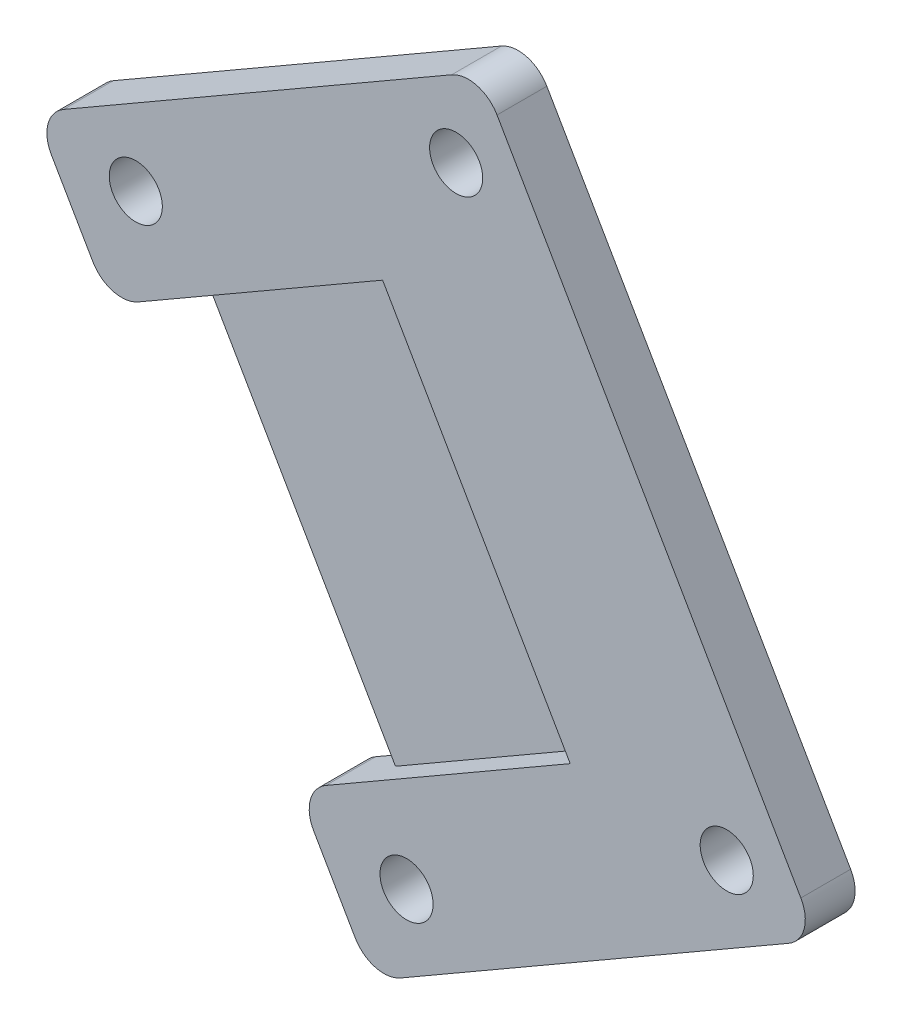
ISO-10303-21;
HEADER;
FILE_DESCRIPTION(('STEP AP214'),'2;1');
FILE_NAME('part.step','',(''),(''),'','','');
FILE_SCHEMA(('AUTOMOTIVE_DESIGN { 1 0 10303 214 1 1 1 1 }'));
ENDSEC;
DATA;
#1=APPLICATION_CONTEXT('core data for automotive mechanical design processes');
#2=APPLICATION_PROTOCOL_DEFINITION('international standard','automotive_design',2000,#1);
#3=PRODUCT_CONTEXT('',#1,'mechanical');
#4=PRODUCT('Part','Part','',(#3));
#5=PRODUCT_RELATED_PRODUCT_CATEGORY('part','',(#4));
#6=PRODUCT_DEFINITION_FORMATION('','',#4);
#7=PRODUCT_DEFINITION_CONTEXT('part definition',#1,'design');
#8=PRODUCT_DEFINITION('design','',#6,#7);
#9=PRODUCT_DEFINITION_SHAPE('','',#8);
#10=(LENGTH_UNIT() NAMED_UNIT(*) SI_UNIT(.MILLI.,.METRE.));
#11=(NAMED_UNIT(*) PLANE_ANGLE_UNIT() SI_UNIT($,.RADIAN.));
#12=(NAMED_UNIT(*) SI_UNIT($,.STERADIAN.) SOLID_ANGLE_UNIT());
#13=UNCERTAINTY_MEASURE_WITH_UNIT(LENGTH_MEASURE(1.E-05),#10,'distance_accuracy_value','');
#14=(GEOMETRIC_REPRESENTATION_CONTEXT(3) GLOBAL_UNCERTAINTY_ASSIGNED_CONTEXT((#13)) GLOBAL_UNIT_ASSIGNED_CONTEXT((#10,
#11,#12)) REPRESENTATION_CONTEXT('',''));
#15=CARTESIAN_POINT('',(0.,0.,0.));
#16=DIRECTION('',(0.,0.,1.));
#17=DIRECTION('',(1.,0.,0.));
#18=AXIS2_PLACEMENT_3D('',#15,#16,#17);
#19=CARTESIAN_POINT('',(-57.6564570166425,-46.3360870627642,-3.));
#20=DIRECTION('',(-0.866025403784438,-0.5,0.));
#21=DIRECTION('',(0.5,-0.866025403784438,0.));
#22=AXIS2_PLACEMENT_3D('',#19,#20,#21);
#23=PLANE('',#22);
#24=DIRECTION('',(0.,0.,1.));
#25=VECTOR('',#24,1.);
#26=CARTESIAN_POINT('',(-57.6564570166425,-46.3360870627642,-3.));
#27=LINE('',#26,#25);
#28=CARTESIAN_POINT('',(-57.6564570166425,-46.3360870627642,-3.));
#29=VERTEX_POINT('',#28);
#30=CARTESIAN_POINT('',(-57.6564570166425,-46.3360870627642,-1.6));
#31=VERTEX_POINT('',#30);
#32=EDGE_CURVE('E241',#29,#31,#27,.T.);
#33=ORIENTED_EDGE('',*,*,#32,.T.);
#34=DIRECTION('',(0.5,-0.866025403784438,0.));
#35=VECTOR('',#34,1.);
#36=CARTESIAN_POINT('',(-68.9564570166425,-26.7639129372359,-1.6));
#37=LINE('',#36,#35);
#38=CARTESIAN_POINT('',(-68.9564570166425,-26.7639129372359,-1.6));
#39=VERTEX_POINT('',#38);
#40=EDGE_CURVE('E156',#39,#31,#37,.T.);
#41=ORIENTED_EDGE('',*,*,#40,.F.);
#42=DIRECTION('',(0.,0.,1.));
#43=VECTOR('',#42,1.);
#44=CARTESIAN_POINT('',(-68.9564570166425,-26.7639129372359,-3.));
#45=LINE('',#44,#43);
#46=CARTESIAN_POINT('',(-68.9564570166425,-26.7639129372359,-3.));
#47=VERTEX_POINT('',#46);
#48=EDGE_CURVE('E224',#47,#39,#45,.T.);
#49=ORIENTED_EDGE('',*,*,#48,.F.);
#50=DIRECTION('',(0.5,-0.866025403784438,0.));
#51=VECTOR('',#50,1.);
#52=CARTESIAN_POINT('',(-57.6564570166425,-46.3360870627642,-3.));
#53=LINE('',#52,#51);
#54=EDGE_CURVE('E207',#47,#29,#53,.T.);
#55=ORIENTED_EDGE('',*,*,#54,.T.);
#56=EDGE_LOOP('',(#33,#41,#49,#55));
#57=FACE_BOUND('',#56,.T.);
#58=ADVANCED_FACE('F33',(#57),#23,.T.);
#59=CARTESIAN_POINT('',(-73.2865840355647,-29.2639129372359,-3.));
#60=DIRECTION('',(-0.866025403784438,-0.500000000000001,0.));
#61=DIRECTION('',(0.500000000000001,-0.866025403784438,0.));
#62=AXIS2_PLACEMENT_3D('',#59,#60,#61);
#63=PLANE('',#62);
#64=DIRECTION('',(0.500000000000001,-0.866025403784438,0.));
#65=VECTOR('',#64,1.);
#66=CARTESIAN_POINT('',(-73.2865840355647,-29.2639129372359,-3.));
#67=LINE('',#66,#65);
#68=CARTESIAN_POINT('',(-76.7865840355647,-23.2017351107448,-3.));
#69=VERTEX_POINT('',#68);
#70=CARTESIAN_POINT('',(-74.2865840355647,-27.531862129667,-3.));
#71=VERTEX_POINT('',#70);
#72=EDGE_CURVE('E201',#69,#71,#67,.T.);
#73=ORIENTED_EDGE('',*,*,#72,.T.);
#74=DIRECTION('',(0.,0.,1.));
#75=VECTOR('',#74,1.);
#76=CARTESIAN_POINT('',(-74.2865840355647,-27.531862129667,-3.));
#77=LINE('',#76,#75);
#78=CARTESIAN_POINT('',(-74.2865840355647,-27.531862129667,0.));
#79=VERTEX_POINT('',#78);
#80=EDGE_CURVE('E278',#71,#79,#77,.T.);
#81=ORIENTED_EDGE('',*,*,#80,.T.);
#82=DIRECTION('',(0.500000000000001,-0.866025403784438,0.));
#83=VECTOR('',#82,1.);
#84=CARTESIAN_POINT('',(-73.2865840355647,-29.2639129372359,0.));
#85=LINE('',#84,#83);
#86=CARTESIAN_POINT('',(-76.7865840355647,-23.2017351107448,0.));
#87=VERTEX_POINT('',#86);
#88=EDGE_CURVE('E198',#87,#79,#85,.T.);
#89=ORIENTED_EDGE('',*,*,#88,.F.);
#90=DIRECTION('',(0.,0.,1.));
#91=VECTOR('',#90,1.);
#92=CARTESIAN_POINT('',(-76.7865840355647,-23.2017351107448,-3.));
#93=LINE('',#92,#91);
#94=EDGE_CURVE('E276',#87,#69,#93,.F.);
#95=ORIENTED_EDGE('',*,*,#94,.T.);
#96=EDGE_LOOP('',(#73,#81,#89,#95));
#97=FACE_BOUND('',#96,.T.);
#98=ADVANCED_FACE('F327',(#97),#63,.T.);
#99=CARTESIAN_POINT('',(-77.7865840355647,-21.4696843031759,-3.));
#100=DIRECTION('',(-0.500000000000001,0.866025403784438,0.));
#101=DIRECTION('',(-0.866025403784438,-0.500000000000001,0.));
#102=AXIS2_PLACEMENT_3D('',#99,#100,#101);
#103=PLANE('',#102);
#104=DIRECTION('',(-0.866025403784438,-0.500000000000001,0.));
#105=VECTOR('',#104,1.);
#106=CARTESIAN_POINT('',(-77.7865840355647,-21.4696843031759,0.));
#107=LINE('',#106,#105);
#108=CARTESIAN_POINT('',(-52.671847325816,-6.96968430317589,0.));
#109=VERTEX_POINT('',#108);
#110=CARTESIAN_POINT('',(-76.0545332279958,-20.4696843031759,0.));
#111=VERTEX_POINT('',#110);
#112=EDGE_CURVE('E205',#109,#111,#107,.T.);
#113=ORIENTED_EDGE('',*,*,#112,.F.);
#114=DIRECTION('',(0.,0.,1.));
#115=VECTOR('',#114,1.);
#116=CARTESIAN_POINT('',(-52.671847325816,-6.96968430317589,-3.));
#117=LINE('',#116,#115);
#118=CARTESIAN_POINT('',(-52.671847325816,-6.96968430317589,-3.));
#119=VERTEX_POINT('',#118);
#120=EDGE_CURVE('E290',#109,#119,#117,.F.);
#121=ORIENTED_EDGE('',*,*,#120,.T.);
#122=DIRECTION('',(-0.866025403784438,-0.500000000000001,0.));
#123=VECTOR('',#122,1.);
#124=CARTESIAN_POINT('',(-77.7865840355647,-21.4696843031759,-3.));
#125=LINE('',#124,#123);
#126=CARTESIAN_POINT('',(-76.0545332279958,-20.4696843031759,-3.));
#127=VERTEX_POINT('',#126);
#128=EDGE_CURVE('E221',#119,#127,#125,.T.);
#129=ORIENTED_EDGE('',*,*,#128,.T.);
#130=DIRECTION('',(0.,0.,1.));
#131=VECTOR('',#130,1.);
#132=CARTESIAN_POINT('',(-76.0545332279958,-20.4696843031759,-3.));
#133=LINE('',#132,#131);
#134=EDGE_CURVE('E287',#127,#111,#133,.T.);
#135=ORIENTED_EDGE('',*,*,#134,.T.);
#136=EDGE_LOOP('',(#113,#121,#129,#135));
#137=FACE_BOUND('',#136,.T.);
#138=ADVANCED_FACE('F335',(#137),#103,.T.);
#139=CARTESIAN_POINT('',(-50.9397965182471,-5.96968430317589,-3.));
#140=DIRECTION('',(0.866025403784438,0.500000000000001,0.));
#141=DIRECTION('',(-0.500000000000001,0.866025403784438,0.));
#142=AXIS2_PLACEMENT_3D('',#139,#140,#141);
#143=PLANE('',#142);
#144=DIRECTION('',(-0.500000000000001,0.866025403784438,0.));
#145=VECTOR('',#144,1.);
#146=CARTESIAN_POINT('',(-50.9397965182471,-5.96968430317589,-3.));
#147=LINE('',#146,#145);
#148=CARTESIAN_POINT('',(-31.639796518247,-39.3982648892552,-3.));
#149=VERTEX_POINT('',#148);
#150=CARTESIAN_POINT('',(-49.9397965182471,-7.70173511074477,-3.));
#151=VERTEX_POINT('',#150);
#152=EDGE_CURVE('E218',#149,#151,#147,.T.);
#153=ORIENTED_EDGE('',*,*,#152,.T.);
#154=DIRECTION('',(0.,0.,1.));
#155=VECTOR('',#154,1.);
#156=CARTESIAN_POINT('',(-49.9397965182471,-7.70173511074476,-3.));
#157=LINE('',#156,#155);
#158=CARTESIAN_POINT('',(-49.9397965182471,-7.70173511074477,0.));
#159=VERTEX_POINT('',#158);
#160=EDGE_CURVE('E284',#151,#159,#157,.T.);
#161=ORIENTED_EDGE('',*,*,#160,.T.);
#162=DIRECTION('',(-0.500000000000001,0.866025403784438,0.));
#163=VECTOR('',#162,1.);
#164=CARTESIAN_POINT('',(-50.9397965182471,-5.96968430317589,0.));
#165=LINE('',#164,#163);
#166=CARTESIAN_POINT('',(-31.639796518247,-39.3982648892552,0.));
#167=VERTEX_POINT('',#166);
#168=EDGE_CURVE('E236',#167,#159,#165,.T.);
#169=ORIENTED_EDGE('',*,*,#168,.F.);
#170=DIRECTION('',(0.,0.,1.));
#171=VECTOR('',#170,1.);
#172=CARTESIAN_POINT('',(-31.639796518247,-39.3982648892552,-3.));
#173=LINE('',#172,#171);
#174=EDGE_CURVE('E282',#167,#149,#173,.F.);
#175=ORIENTED_EDGE('',*,*,#174,.T.);
#176=EDGE_LOOP('',(#153,#161,#169,#175));
#177=FACE_BOUND('',#176,.T.);
#178=ADVANCED_FACE('F344',(#177),#143,.T.);
#179=CARTESIAN_POINT('',(-30.639796518247,-41.1303156968241,-3.));
#180=DIRECTION('',(0.500000000000001,-0.866025403784438,0.));
#181=DIRECTION('',(0.866025403784438,0.500000000000001,0.));
#182=AXIS2_PLACEMENT_3D('',#179,#180,#181);
#183=PLANE('',#182);
#184=DIRECTION('',(0.866025403784438,0.500000000000001,0.));
#185=VECTOR('',#184,1.);
#186=CARTESIAN_POINT('',(-30.639796518247,-41.1303156968241,-3.));
#187=LINE('',#186,#185);
#188=CARTESIAN_POINT('',(-55.7545332279958,-55.6303156968241,-3.));
#189=VERTEX_POINT('',#188);
#190=CARTESIAN_POINT('',(-32.3718473258159,-42.1303156968241,-3.));
#191=VERTEX_POINT('',#190);
#192=EDGE_CURVE('E215',#189,#191,#187,.T.);
#193=ORIENTED_EDGE('',*,*,#192,.T.);
#194=DIRECTION('',(0.,0.,1.));
#195=VECTOR('',#194,1.);
#196=CARTESIAN_POINT('',(-32.3718473258159,-42.1303156968241,-3.));
#197=LINE('',#196,#195);
#198=CARTESIAN_POINT('',(-32.3718473258159,-42.1303156968241,0.));
#199=VERTEX_POINT('',#198);
#200=EDGE_CURVE('E11',#191,#199,#197,.T.);
#201=ORIENTED_EDGE('',*,*,#200,.T.);
#202=DIRECTION('',(0.866025403784438,0.500000000000001,0.));
#203=VECTOR('',#202,1.);
#204=CARTESIAN_POINT('',(-30.639796518247,-41.1303156968241,0.));
#205=LINE('',#204,#203);
#206=CARTESIAN_POINT('',(-55.7545332279958,-55.6303156968241,0.));
#207=VERTEX_POINT('',#206);
#208=EDGE_CURVE('E233',#207,#199,#205,.T.);
#209=ORIENTED_EDGE('',*,*,#208,.F.);
#210=DIRECTION('',(0.,0.,1.));
#211=VECTOR('',#210,1.);
#212=CARTESIAN_POINT('',(-55.7545332279958,-55.6303156968241,-3.));
#213=LINE('',#212,#211);
#214=EDGE_CURVE('E41',#207,#189,#213,.F.);
#215=ORIENTED_EDGE('',*,*,#214,.T.);
#216=EDGE_LOOP('',(#193,#201,#209,#215));
#217=FACE_BOUND('',#216,.T.);
#218=ADVANCED_FACE('F295',(#217),#183,.T.);
#219=CARTESIAN_POINT('',(-57.4865840355646,-56.6303156968241,-3.));
#220=DIRECTION('',(-0.866025403784437,-0.500000000000002,0.));
#221=DIRECTION('',(0.500000000000002,-0.866025403784437,0.));
#222=AXIS2_PLACEMENT_3D('',#219,#220,#221);
#223=PLANE('',#222);
#224=DIRECTION('',(0.500000000000002,-0.866025403784437,0.));
#225=VECTOR('',#224,1.);
#226=CARTESIAN_POINT('',(-57.4865840355646,-56.6303156968241,0.));
#227=LINE('',#226,#225);
#228=CARTESIAN_POINT('',(-60.9865840355647,-50.568137870333,0.));
#229=VERTEX_POINT('',#228);
#230=CARTESIAN_POINT('',(-58.4865840355646,-54.8982648892552,0.));
#231=VERTEX_POINT('',#230);
#232=EDGE_CURVE('E230',#229,#231,#227,.T.);
#233=ORIENTED_EDGE('',*,*,#232,.F.);
#234=DIRECTION('',(0.,0.,1.));
#235=VECTOR('',#234,1.);
#236=CARTESIAN_POINT('',(-60.9865840355647,-50.568137870333,-3.));
#237=LINE('',#236,#235);
#238=CARTESIAN_POINT('',(-60.9865840355647,-50.568137870333,-3.));
#239=VERTEX_POINT('',#238);
#240=EDGE_CURVE('E262',#229,#239,#237,.F.);
#241=ORIENTED_EDGE('',*,*,#240,.T.);
#242=DIRECTION('',(0.500000000000002,-0.866025403784437,0.));
#243=VECTOR('',#242,1.);
#244=CARTESIAN_POINT('',(-57.4865840355646,-56.6303156968241,-3.));
#245=LINE('',#244,#243);
#246=CARTESIAN_POINT('',(-58.4865840355646,-54.8982648892552,-3.));
#247=VERTEX_POINT('',#246);
#248=EDGE_CURVE('E212',#239,#247,#245,.T.);
#249=ORIENTED_EDGE('',*,*,#248,.T.);
#250=DIRECTION('',(0.,0.,1.));
#251=VECTOR('',#250,1.);
#252=CARTESIAN_POINT('',(-58.4865840355646,-54.8982648892552,-3.));
#253=LINE('',#252,#251);
#254=EDGE_CURVE('E259',#247,#231,#253,.T.);
#255=ORIENTED_EDGE('',*,*,#254,.T.);
#256=EDGE_LOOP('',(#233,#241,#249,#255));
#257=FACE_BOUND('',#256,.T.);
#258=ADVANCED_FACE('F307',(#257),#223,.T.);
#259=CARTESIAN_POINT('',(-61.9865840355647,-48.8360870627642,-3.));
#260=DIRECTION('',(-0.500000000000001,0.866025403784438,0.));
#261=DIRECTION('',(-0.866025403784438,-0.500000000000001,0.));
#262=AXIS2_PLACEMENT_3D('',#259,#260,#261);
#263=PLANE('',#262);
#264=DIRECTION('',(-0.866025403784438,-0.500000000000001,0.));
#265=VECTOR('',#264,1.);
#266=CARTESIAN_POINT('',(-61.9865840355647,-48.8360870627642,-3.));
#267=LINE('',#266,#265);
#268=CARTESIAN_POINT('',(-60.2545332279958,-47.8360870627642,-3.));
#269=VERTEX_POINT('',#268);
#270=EDGE_CURVE('E210',#29,#269,#267,.T.);
#271=ORIENTED_EDGE('',*,*,#270,.T.);
#272=DIRECTION('',(0.,0.,1.));
#273=VECTOR('',#272,1.);
#274=CARTESIAN_POINT('',(-60.2545332279958,-47.8360870627642,-3.));
#275=LINE('',#274,#273);
#276=CARTESIAN_POINT('',(-60.2545332279958,-47.8360870627642,0.));
#277=VERTEX_POINT('',#276);
#278=EDGE_CURVE('E243',#269,#277,#275,.T.);
#279=ORIENTED_EDGE('',*,*,#278,.T.);
#280=DIRECTION('',(-0.866025403784438,-0.500000000000001,0.));
#281=VECTOR('',#280,1.);
#282=CARTESIAN_POINT('',(-61.9865840355647,-48.8360870627642,0.));
#283=LINE('',#282,#281);
#284=CARTESIAN_POINT('',(-45.5321013636603,-39.3360870627642,0.));
#285=VERTEX_POINT('',#284);
#286=EDGE_CURVE('E48',#285,#277,#283,.T.);
#287=ORIENTED_EDGE('',*,*,#286,.F.);
#288=DIRECTION('',(0.,0.,1.));
#289=VECTOR('',#288,1.);
#290=CARTESIAN_POINT('',(-45.5321013636603,-39.3360870627642,-1.6));
#291=LINE('',#290,#289);
#292=CARTESIAN_POINT('',(-45.5321013636603,-39.3360870627642,-1.6));
#293=VERTEX_POINT('',#292);
#294=EDGE_CURVE('E145',#293,#285,#291,.T.);
#295=ORIENTED_EDGE('',*,*,#294,.F.);
#296=DIRECTION('',(0.866025403784439,0.5,0.));
#297=VECTOR('',#296,1.);
#298=CARTESIAN_POINT('',(-45.5321013636603,-39.3360870627642,-1.6));
#299=LINE('',#298,#297);
#300=EDGE_CURVE('E150',#31,#293,#299,.T.);
#301=ORIENTED_EDGE('',*,*,#300,.F.);
#302=ORIENTED_EDGE('',*,*,#32,.F.);
#303=EDGE_LOOP('',(#271,#279,#287,#295,#301,#302));
#304=FACE_BOUND('',#303,.T.);
#305=ADVANCED_FACE('F148',(#304),#263,.T.);
#306=CARTESIAN_POINT('',(-68.9564570166425,-26.7639129372359,-3.));
#307=DIRECTION('',(0.5,-0.866025403784438,0.));
#308=DIRECTION('',(0.866025403784438,0.5,0.));
#309=AXIS2_PLACEMENT_3D('',#306,#307,#308);
#310=PLANE('',#309);
#311=DIRECTION('',(0.866025403784438,0.5,0.));
#312=VECTOR('',#311,1.);
#313=CARTESIAN_POINT('',(-68.9564570166425,-26.7639129372359,0.));
#314=LINE('',#313,#312);
#315=CARTESIAN_POINT('',(-71.5545332279958,-28.2639129372359,0.));
#316=VERTEX_POINT('',#315);
#317=CARTESIAN_POINT('',(-56.8321013636603,-19.7639129372359,0.));
#318=VERTEX_POINT('',#317);
#319=EDGE_CURVE('E227',#316,#318,#314,.T.);
#320=ORIENTED_EDGE('',*,*,#319,.F.);
#321=DIRECTION('',(0.,0.,1.));
#322=VECTOR('',#321,1.);
#323=CARTESIAN_POINT('',(-71.5545332279958,-28.2639129372359,-3.));
#324=LINE('',#323,#322);
#325=CARTESIAN_POINT('',(-71.5545332279958,-28.2639129372359,-3.));
#326=VERTEX_POINT('',#325);
#327=EDGE_CURVE('E56',#316,#326,#324,.F.);
#328=ORIENTED_EDGE('',*,*,#327,.T.);
#329=DIRECTION('',(0.866025403784438,0.5,0.));
#330=VECTOR('',#329,1.);
#331=CARTESIAN_POINT('',(-68.9564570166425,-26.7639129372359,-3.));
#332=LINE('',#331,#330);
#333=EDGE_CURVE('E204',#326,#47,#332,.T.);
#334=ORIENTED_EDGE('',*,*,#333,.T.);
#335=ORIENTED_EDGE('',*,*,#48,.T.);
#336=DIRECTION('',(-0.866025403784439,-0.5,0.));
#337=VECTOR('',#336,1.);
#338=CARTESIAN_POINT('',(-56.8321013636603,-19.7639129372359,-1.6));
#339=LINE('',#338,#337);
#340=CARTESIAN_POINT('',(-56.8321013636603,-19.7639129372359,-1.6));
#341=VERTEX_POINT('',#340);
#342=EDGE_CURVE('E164',#341,#39,#339,.T.);
#343=ORIENTED_EDGE('',*,*,#342,.F.);
#344=DIRECTION('',(0.,0.,1.));
#345=VECTOR('',#344,1.);
#346=CARTESIAN_POINT('',(-56.8321013636603,-19.7639129372359,-1.6));
#347=LINE('',#346,#345);
#348=EDGE_CURVE('E155',#341,#318,#347,.T.);
#349=ORIENTED_EDGE('',*,*,#348,.T.);
#350=EDGE_LOOP('',(#320,#328,#334,#335,#343,#349));
#351=FACE_BOUND('',#350,.T.);
#352=ADVANCED_FACE('F319',(#351),#310,.T.);
#353=CARTESIAN_POINT('',(0.,0.,-3.));
#354=DIRECTION('',(0.,0.,-1.));
#355=DIRECTION('',(-1.,0.,0.));
#356=AXIS2_PLACEMENT_3D('',#353,#354,#355);
#357=PLANE('',#356);
#358=CARTESIAN_POINT('',(-36.1038981333848,-39.6662140816864,-3.));
#359=DIRECTION('',(0.,0.,1.));
#360=DIRECTION('',(1.,0.,0.));
#361=AXIS2_PLACEMENT_3D('',#358,#359,#360);
#362=CIRCLE('',#361,1.60000000000001);
#363=CARTESIAN_POINT('',(-34.5038981333848,-39.6662140816864,-3.));
#364=VERTEX_POINT('',#363);
#365=EDGE_CURVE('E177',#364,#364,#362,.T.);
#366=ORIENTED_EDGE('',*,*,#365,.T.);
#367=EDGE_LOOP('',(#366));
#368=FACE_BOUND('',#367,.T.);
#369=CARTESIAN_POINT('',(-52.4038981333848,-11.4337859183136,-3.));
#370=DIRECTION('',(0.,0.,1.));
#371=DIRECTION('',(1.,0.,0.));
#372=AXIS2_PLACEMENT_3D('',#369,#370,#371);
#373=CIRCLE('',#372,1.6);
#374=CARTESIAN_POINT('',(-50.8038981333848,-11.4337859183136,-3.));
#375=VERTEX_POINT('',#374);
#376=EDGE_CURVE('E183',#375,#375,#373,.T.);
#377=ORIENTED_EDGE('',*,*,#376,.T.);
#378=EDGE_LOOP('',(#377));
#379=FACE_BOUND('',#378,.T.);
#380=CARTESIAN_POINT('',(-71.700243720423,-22.5630263124186,-3.));
#381=DIRECTION('',(0.,0.,1.));
#382=DIRECTION('',(1.,0.,0.));
#383=AXIS2_PLACEMENT_3D('',#380,#381,#382);
#384=CIRCLE('',#383,1.6);
#385=CARTESIAN_POINT('',(-70.100243720423,-22.5630263124186,-3.));
#386=VERTEX_POINT('',#385);
#387=EDGE_CURVE('E189',#386,#386,#384,.T.);
#388=ORIENTED_EDGE('',*,*,#387,.T.);
#389=EDGE_LOOP('',(#388));
#390=FACE_BOUND('',#389,.T.);
#391=CARTESIAN_POINT('',(-55.3902758330228,-50.8127193632125,-3.));
#392=DIRECTION('',(0.,0.,1.));
#393=DIRECTION('',(1.,0.,0.));
#394=AXIS2_PLACEMENT_3D('',#391,#392,#393);
#395=CIRCLE('',#394,1.6);
#396=CARTESIAN_POINT('',(-53.7902758330228,-50.8127193632125,-3.));
#397=VERTEX_POINT('',#396);
#398=EDGE_CURVE('E195',#397,#397,#395,.T.);
#399=ORIENTED_EDGE('',*,*,#398,.T.);
#400=EDGE_LOOP('',(#399));
#401=FACE_BOUND('',#400,.T.);
#402=ORIENTED_EDGE('',*,*,#248,.F.);
#403=CARTESIAN_POINT('',(-59.2545332279958,-49.568137870333,-3.));
#404=DIRECTION('',(0.,0.,-1.));
#405=DIRECTION('',(-1.,0.,0.));
#406=AXIS2_PLACEMENT_3D('',#403,#404,#405);
#407=CIRCLE('',#406,2.);
#408=EDGE_CURVE('E274',#239,#269,#407,.T.);
#409=ORIENTED_EDGE('',*,*,#408,.T.);
#410=ORIENTED_EDGE('',*,*,#270,.F.);
#411=ORIENTED_EDGE('',*,*,#54,.F.);
#412=ORIENTED_EDGE('',*,*,#333,.F.);
#413=CARTESIAN_POINT('',(-72.5545332279958,-26.531862129667,-3.));
#414=DIRECTION('',(0.,0.,-1.));
#415=DIRECTION('',(-1.,0.,0.));
#416=AXIS2_PLACEMENT_3D('',#413,#414,#415);
#417=CIRCLE('',#416,2.);
#418=EDGE_CURVE('E272',#326,#71,#417,.T.);
#419=ORIENTED_EDGE('',*,*,#418,.T.);
#420=ORIENTED_EDGE('',*,*,#72,.F.);
#421=CARTESIAN_POINT('',(-75.0545332279958,-22.2017351107448,-3.));
#422=DIRECTION('',(0.,0.,-1.));
#423=DIRECTION('',(-1.,0.,0.));
#424=AXIS2_PLACEMENT_3D('',#421,#422,#423);
#425=CIRCLE('',#424,2.);
#426=EDGE_CURVE('E268',#69,#127,#425,.T.);
#427=ORIENTED_EDGE('',*,*,#426,.T.);
#428=ORIENTED_EDGE('',*,*,#128,.F.);
#429=CARTESIAN_POINT('',(-51.671847325816,-8.70173511074477,-3.));
#430=DIRECTION('',(0.,0.,-1.));
#431=DIRECTION('',(-1.,0.,0.));
#432=AXIS2_PLACEMENT_3D('',#429,#430,#431);
#433=CIRCLE('',#432,2.);
#434=EDGE_CURVE('E270',#119,#151,#433,.T.);
#435=ORIENTED_EDGE('',*,*,#434,.T.);
#436=ORIENTED_EDGE('',*,*,#152,.F.);
#437=CARTESIAN_POINT('',(-33.3718473258159,-40.3982648892552,-3.));
#438=DIRECTION('',(0.,0.,-1.));
#439=DIRECTION('',(-1.,0.,0.));
#440=AXIS2_PLACEMENT_3D('',#437,#438,#439);
#441=CIRCLE('',#440,2.);
#442=EDGE_CURVE('E266',#149,#191,#441,.T.);
#443=ORIENTED_EDGE('',*,*,#442,.T.);
#444=ORIENTED_EDGE('',*,*,#192,.F.);
#445=CARTESIAN_POINT('',(-56.7545332279958,-53.8982648892552,-3.));
#446=DIRECTION('',(0.,0.,-1.));
#447=DIRECTION('',(-1.,0.,0.));
#448=AXIS2_PLACEMENT_3D('',#445,#446,#447);
#449=CIRCLE('',#448,2.);
#450=EDGE_CURVE('E264',#189,#247,#449,.T.);
#451=ORIENTED_EDGE('',*,*,#450,.T.);
#452=EDGE_LOOP('',(#402,#409,#410,#411,#412,#419,#420,#427,#428,#435,#436,#443,#444,#451));
#453=FACE_BOUND('',#452,.T.);
#454=ADVANCED_FACE('F301',(#368,#379,#390,#401,#453),#357,.T.);
#455=CARTESIAN_POINT('',(0.,0.,0.));
#456=DIRECTION('',(0.,0.,-1.));
#457=DIRECTION('',(-1.,0.,0.));
#458=AXIS2_PLACEMENT_3D('',#455,#456,#457);
#459=PLANE('',#458);
#460=CARTESIAN_POINT('',(-36.1038981333848,-39.6662140816864,0.));
#461=DIRECTION('',(0.,0.,1.));
#462=DIRECTION('',(1.,0.,0.));
#463=AXIS2_PLACEMENT_3D('',#460,#461,#462);
#464=CIRCLE('',#463,1.60000000000001);
#465=CARTESIAN_POINT('',(-34.5038981333848,-39.6662140816864,0.));
#466=VERTEX_POINT('',#465);
#467=EDGE_CURVE('E175',#466,#466,#464,.T.);
#468=ORIENTED_EDGE('',*,*,#467,.F.);
#469=EDGE_LOOP('',(#468));
#470=FACE_BOUND('',#469,.T.);
#471=CARTESIAN_POINT('',(-52.4038981333848,-11.4337859183136,0.));
#472=DIRECTION('',(0.,0.,1.));
#473=DIRECTION('',(1.,0.,0.));
#474=AXIS2_PLACEMENT_3D('',#471,#472,#473);
#475=CIRCLE('',#474,1.6);
#476=CARTESIAN_POINT('',(-50.8038981333848,-11.4337859183136,0.));
#477=VERTEX_POINT('',#476);
#478=EDGE_CURVE('E180',#477,#477,#475,.T.);
#479=ORIENTED_EDGE('',*,*,#478,.F.);
#480=EDGE_LOOP('',(#479));
#481=FACE_BOUND('',#480,.T.);
#482=CARTESIAN_POINT('',(-71.700243720423,-22.5630263124186,0.));
#483=DIRECTION('',(0.,0.,1.));
#484=DIRECTION('',(1.,0.,0.));
#485=AXIS2_PLACEMENT_3D('',#482,#483,#484);
#486=CIRCLE('',#485,1.6);
#487=CARTESIAN_POINT('',(-70.100243720423,-22.5630263124186,0.));
#488=VERTEX_POINT('',#487);
#489=EDGE_CURVE('E186',#488,#488,#486,.T.);
#490=ORIENTED_EDGE('',*,*,#489,.F.);
#491=EDGE_LOOP('',(#490));
#492=FACE_BOUND('',#491,.T.);
#493=CARTESIAN_POINT('',(-55.3902758330228,-50.8127193632125,0.));
#494=DIRECTION('',(0.,0.,1.));
#495=DIRECTION('',(1.,0.,0.));
#496=AXIS2_PLACEMENT_3D('',#493,#494,#495);
#497=CIRCLE('',#496,1.6);
#498=CARTESIAN_POINT('',(-53.7902758330228,-50.8127193632125,0.));
#499=VERTEX_POINT('',#498);
#500=EDGE_CURVE('E192',#499,#499,#497,.T.);
#501=ORIENTED_EDGE('',*,*,#500,.F.);
#502=EDGE_LOOP('',(#501));
#503=FACE_BOUND('',#502,.T.);
#504=DIRECTION('',(-0.5,0.866025403784438,0.));
#505=VECTOR('',#504,1.);
#506=CARTESIAN_POINT('',(-45.5321013636603,-39.3360870627642,0.));
#507=LINE('',#506,#505);
#508=EDGE_CURVE('E169',#285,#318,#507,.T.);
#509=ORIENTED_EDGE('',*,*,#508,.F.);
#510=ORIENTED_EDGE('',*,*,#286,.T.);
#511=CARTESIAN_POINT('',(-59.2545332279958,-49.568137870333,0.));
#512=DIRECTION('',(0.,0.,-1.));
#513=DIRECTION('',(-1.,0.,0.));
#514=AXIS2_PLACEMENT_3D('',#511,#512,#513);
#515=CIRCLE('',#514,2.);
#516=EDGE_CURVE('E257',#277,#229,#515,.F.);
#517=ORIENTED_EDGE('',*,*,#516,.T.);
#518=ORIENTED_EDGE('',*,*,#232,.T.);
#519=CARTESIAN_POINT('',(-56.7545332279958,-53.8982648892552,0.));
#520=DIRECTION('',(0.,0.,-1.));
#521=DIRECTION('',(-1.,0.,0.));
#522=AXIS2_PLACEMENT_3D('',#519,#520,#521);
#523=CIRCLE('',#522,2.);
#524=EDGE_CURVE('E247',#231,#207,#523,.F.);
#525=ORIENTED_EDGE('',*,*,#524,.T.);
#526=ORIENTED_EDGE('',*,*,#208,.T.);
#527=CARTESIAN_POINT('',(-33.3718473258159,-40.3982648892552,0.));
#528=DIRECTION('',(0.,0.,-1.));
#529=DIRECTION('',(-1.,0.,0.));
#530=AXIS2_PLACEMENT_3D('',#527,#528,#529);
#531=CIRCLE('',#530,2.);
#532=EDGE_CURVE('E249',#199,#167,#531,.F.);
#533=ORIENTED_EDGE('',*,*,#532,.T.);
#534=ORIENTED_EDGE('',*,*,#168,.T.);
#535=CARTESIAN_POINT('',(-51.671847325816,-8.70173511074477,0.));
#536=DIRECTION('',(0.,0.,-1.));
#537=DIRECTION('',(-1.,0.,0.));
#538=AXIS2_PLACEMENT_3D('',#535,#536,#537);
#539=CIRCLE('',#538,2.);
#540=EDGE_CURVE('E253',#159,#109,#539,.F.);
#541=ORIENTED_EDGE('',*,*,#540,.T.);
#542=ORIENTED_EDGE('',*,*,#112,.T.);
#543=CARTESIAN_POINT('',(-75.0545332279958,-22.2017351107448,0.));
#544=DIRECTION('',(0.,0.,-1.));
#545=DIRECTION('',(-1.,0.,0.));
#546=AXIS2_PLACEMENT_3D('',#543,#544,#545);
#547=CIRCLE('',#546,2.);
#548=EDGE_CURVE('E251',#111,#87,#547,.F.);
#549=ORIENTED_EDGE('',*,*,#548,.T.);
#550=ORIENTED_EDGE('',*,*,#88,.T.);
#551=CARTESIAN_POINT('',(-72.5545332279958,-26.531862129667,0.));
#552=DIRECTION('',(0.,0.,-1.));
#553=DIRECTION('',(-1.,0.,0.));
#554=AXIS2_PLACEMENT_3D('',#551,#552,#553);
#555=CIRCLE('',#554,2.);
#556=EDGE_CURVE('E255',#79,#316,#555,.F.);
#557=ORIENTED_EDGE('',*,*,#556,.T.);
#558=ORIENTED_EDGE('',*,*,#319,.T.);
#559=EDGE_LOOP('',(#509,#510,#517,#518,#525,#526,#533,#534,#541,#542,#549,#550,#557,#558));
#560=FACE_BOUND('',#559,.T.);
#561=ADVANCED_FACE('F310',(#470,#481,#492,#503,#560),#459,.F.);
#562=CARTESIAN_POINT('',(-55.3902758330228,-50.8127193632125,-3.));
#563=DIRECTION('',(0.,0.,1.));
#564=DIRECTION('',(1.,0.,0.));
#565=AXIS2_PLACEMENT_3D('',#562,#563,#564);
#566=CYLINDRICAL_SURFACE('',#565,1.6);
#567=ORIENTED_EDGE('',*,*,#398,.F.);
#568=EDGE_LOOP('',(#567));
#569=FACE_BOUND('',#568,.T.);
#570=ORIENTED_EDGE('',*,*,#500,.T.);
#571=EDGE_LOOP('',(#570));
#572=FACE_BOUND('',#571,.T.);
#573=ADVANCED_FACE('F421',(#569,#572),#566,.F.);
#574=CARTESIAN_POINT('',(-71.700243720423,-22.5630263124186,-3.));
#575=DIRECTION('',(0.,0.,1.));
#576=DIRECTION('',(1.,0.,0.));
#577=AXIS2_PLACEMENT_3D('',#574,#575,#576);
#578=CYLINDRICAL_SURFACE('',#577,1.6);
#579=ORIENTED_EDGE('',*,*,#387,.F.);
#580=EDGE_LOOP('',(#579));
#581=FACE_BOUND('',#580,.T.);
#582=ORIENTED_EDGE('',*,*,#489,.T.);
#583=EDGE_LOOP('',(#582));
#584=FACE_BOUND('',#583,.T.);
#585=ADVANCED_FACE('F450',(#581,#584),#578,.F.);
#586=CARTESIAN_POINT('',(-52.4038981333848,-11.4337859183136,-3.));
#587=DIRECTION('',(0.,0.,1.));
#588=DIRECTION('',(1.,0.,0.));
#589=AXIS2_PLACEMENT_3D('',#586,#587,#588);
#590=CYLINDRICAL_SURFACE('',#589,1.6);
#591=ORIENTED_EDGE('',*,*,#376,.F.);
#592=EDGE_LOOP('',(#591));
#593=FACE_BOUND('',#592,.T.);
#594=ORIENTED_EDGE('',*,*,#478,.T.);
#595=EDGE_LOOP('',(#594));
#596=FACE_BOUND('',#595,.T.);
#597=ADVANCED_FACE('F446',(#593,#596),#590,.F.);
#598=CARTESIAN_POINT('',(-36.1038981333848,-39.6662140816864,-3.));
#599=DIRECTION('',(0.,0.,1.));
#600=DIRECTION('',(1.,0.,0.));
#601=AXIS2_PLACEMENT_3D('',#598,#599,#600);
#602=CYLINDRICAL_SURFACE('',#601,1.60000000000001);
#603=ORIENTED_EDGE('',*,*,#365,.F.);
#604=EDGE_LOOP('',(#603));
#605=FACE_BOUND('',#604,.T.);
#606=ORIENTED_EDGE('',*,*,#467,.T.);
#607=EDGE_LOOP('',(#606));
#608=FACE_BOUND('',#607,.T.);
#609=ADVANCED_FACE('F367',(#605,#608),#602,.F.);
#610=CARTESIAN_POINT('',(-59.2545332279958,-49.568137870333,-3.));
#611=DIRECTION('',(0.,0.,1.));
#612=DIRECTION('',(1.,0.,0.));
#613=AXIS2_PLACEMENT_3D('',#610,#611,#612);
#614=CYLINDRICAL_SURFACE('',#613,2.);
#615=ORIENTED_EDGE('',*,*,#408,.F.);
#616=ORIENTED_EDGE('',*,*,#240,.F.);
#617=ORIENTED_EDGE('',*,*,#516,.F.);
#618=ORIENTED_EDGE('',*,*,#278,.F.);
#619=EDGE_LOOP('',(#615,#616,#617,#618));
#620=FACE_BOUND('',#619,.T.);
#621=ADVANCED_FACE('F314',(#620),#614,.T.);
#622=CARTESIAN_POINT('',(-72.5545332279958,-26.531862129667,-3.));
#623=DIRECTION('',(0.,0.,1.));
#624=DIRECTION('',(1.,0.,0.));
#625=AXIS2_PLACEMENT_3D('',#622,#623,#624);
#626=CYLINDRICAL_SURFACE('',#625,2.);
#627=ORIENTED_EDGE('',*,*,#418,.F.);
#628=ORIENTED_EDGE('',*,*,#327,.F.);
#629=ORIENTED_EDGE('',*,*,#556,.F.);
#630=ORIENTED_EDGE('',*,*,#80,.F.);
#631=EDGE_LOOP('',(#627,#628,#629,#630));
#632=FACE_BOUND('',#631,.T.);
#633=ADVANCED_FACE('F324',(#632),#626,.T.);
#634=CARTESIAN_POINT('',(-51.671847325816,-8.70173511074477,-3.));
#635=DIRECTION('',(0.,0.,1.));
#636=DIRECTION('',(1.,0.,0.));
#637=AXIS2_PLACEMENT_3D('',#634,#635,#636);
#638=CYLINDRICAL_SURFACE('',#637,2.);
#639=ORIENTED_EDGE('',*,*,#434,.F.);
#640=ORIENTED_EDGE('',*,*,#120,.F.);
#641=ORIENTED_EDGE('',*,*,#540,.F.);
#642=ORIENTED_EDGE('',*,*,#160,.F.);
#643=EDGE_LOOP('',(#639,#640,#641,#642));
#644=FACE_BOUND('',#643,.T.);
#645=ADVANCED_FACE('F341',(#644),#638,.T.);
#646=CARTESIAN_POINT('',(-75.0545332279958,-22.2017351107448,-3.));
#647=DIRECTION('',(0.,0.,1.));
#648=DIRECTION('',(1.,0.,0.));
#649=AXIS2_PLACEMENT_3D('',#646,#647,#648);
#650=CYLINDRICAL_SURFACE('',#649,2.);
#651=ORIENTED_EDGE('',*,*,#426,.F.);
#652=ORIENTED_EDGE('',*,*,#94,.F.);
#653=ORIENTED_EDGE('',*,*,#548,.F.);
#654=ORIENTED_EDGE('',*,*,#134,.F.);
#655=EDGE_LOOP('',(#651,#652,#653,#654));
#656=FACE_BOUND('',#655,.T.);
#657=ADVANCED_FACE('F333',(#656),#650,.T.);
#658=CARTESIAN_POINT('',(-33.3718473258159,-40.3982648892552,-3.));
#659=DIRECTION('',(0.,0.,1.));
#660=DIRECTION('',(1.,0.,0.));
#661=AXIS2_PLACEMENT_3D('',#658,#659,#660);
#662=CYLINDRICAL_SURFACE('',#661,2.);
#663=ORIENTED_EDGE('',*,*,#442,.F.);
#664=ORIENTED_EDGE('',*,*,#174,.F.);
#665=ORIENTED_EDGE('',*,*,#532,.F.);
#666=ORIENTED_EDGE('',*,*,#200,.F.);
#667=EDGE_LOOP('',(#663,#664,#665,#666));
#668=FACE_BOUND('',#667,.T.);
#669=ADVANCED_FACE('F347',(#668),#662,.T.);
#670=CARTESIAN_POINT('',(-56.7545332279958,-53.8982648892552,-3.));
#671=DIRECTION('',(0.,0.,1.));
#672=DIRECTION('',(1.,0.,0.));
#673=AXIS2_PLACEMENT_3D('',#670,#671,#672);
#674=CYLINDRICAL_SURFACE('',#673,2.);
#675=ORIENTED_EDGE('',*,*,#450,.F.);
#676=ORIENTED_EDGE('',*,*,#214,.F.);
#677=ORIENTED_EDGE('',*,*,#524,.F.);
#678=ORIENTED_EDGE('',*,*,#254,.F.);
#679=EDGE_LOOP('',(#675,#676,#677,#678));
#680=FACE_BOUND('',#679,.T.);
#681=ADVANCED_FACE('F35',(#680),#674,.T.);
#682=CARTESIAN_POINT('',(-45.5321013636603,-39.3360870627642,-1.6));
#683=DIRECTION('',(0.866025403784438,0.5,0.));
#684=DIRECTION('',(-0.5,0.866025403784439,0.));
#685=AXIS2_PLACEMENT_3D('',#682,#683,#684);
#686=PLANE('',#685);
#687=ORIENTED_EDGE('',*,*,#508,.T.);
#688=ORIENTED_EDGE('',*,*,#348,.F.);
#689=DIRECTION('',(-0.5,0.866025403784438,0.));
#690=VECTOR('',#689,1.);
#691=CARTESIAN_POINT('',(-45.5321013636603,-39.3360870627642,-1.6));
#692=LINE('',#691,#690);
#693=EDGE_CURVE('E159',#293,#341,#692,.T.);
#694=ORIENTED_EDGE('',*,*,#693,.F.);
#695=ORIENTED_EDGE('',*,*,#294,.T.);
#696=EDGE_LOOP('',(#687,#688,#694,#695));
#697=FACE_BOUND('',#696,.T.);
#698=ADVANCED_FACE('F160',(#697),#686,.F.);
#699=CARTESIAN_POINT('',(0.,0.,-1.6));
#700=DIRECTION('',(0.,0.,1.));
#701=DIRECTION('',(1.,0.,0.));
#702=AXIS2_PLACEMENT_3D('',#699,#700,#701);
#703=PLANE('',#702);
#704=ORIENTED_EDGE('',*,*,#300,.T.);
#705=ORIENTED_EDGE('',*,*,#693,.T.);
#706=ORIENTED_EDGE('',*,*,#342,.T.);
#707=ORIENTED_EDGE('',*,*,#40,.T.);
#708=EDGE_LOOP('',(#704,#705,#706,#707));
#709=FACE_BOUND('',#708,.T.);
#710=ADVANCED_FACE('F166',(#709),#703,.T.);
#711=CLOSED_SHELL('',(#58,#98,#138,#178,#218,#258,#305,#352,#454,#561,#573,#585,#597,#609,#621,
#633,#645,#657,#669,#681,#698,#710));
#712=MANIFOLD_SOLID_BREP('B2',#711);
#713=ADVANCED_BREP_SHAPE_REPRESENTATION('',(#18,#712),#14);
#714=SHAPE_DEFINITION_REPRESENTATION(#9,#713);
ENDSEC;
END-ISO-10303-21;
